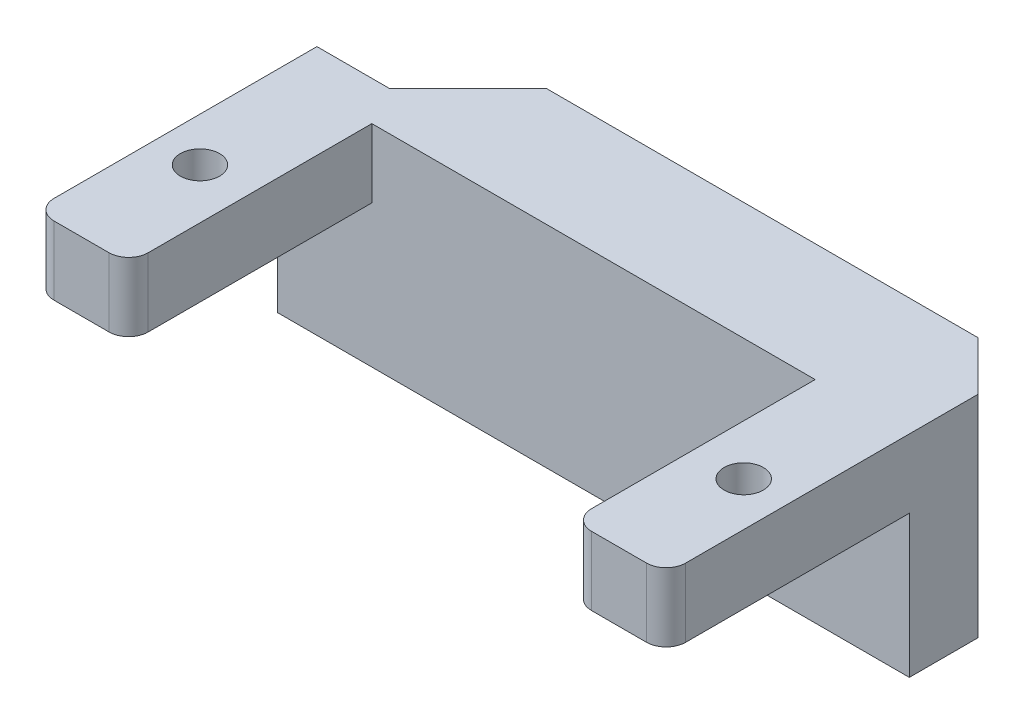
ISO-10303-21;
HEADER;
FILE_DESCRIPTION(('STEP AP214'),'2;1');
FILE_NAME('part.step','',(''),(''),'','','');
FILE_SCHEMA(('AUTOMOTIVE_DESIGN { 1 0 10303 214 1 1 1 1 }'));
ENDSEC;
DATA;
#1=APPLICATION_CONTEXT('core data for automotive mechanical design processes');
#2=APPLICATION_PROTOCOL_DEFINITION('international standard','automotive_design',2000,#1);
#3=PRODUCT_CONTEXT('',#1,'mechanical');
#4=PRODUCT('Part','Part','',(#3));
#5=PRODUCT_RELATED_PRODUCT_CATEGORY('part','',(#4));
#6=PRODUCT_DEFINITION_FORMATION('','',#4);
#7=PRODUCT_DEFINITION_CONTEXT('part definition',#1,'design');
#8=PRODUCT_DEFINITION('design','',#6,#7);
#9=PRODUCT_DEFINITION_SHAPE('','',#8);
#10=(LENGTH_UNIT() NAMED_UNIT(*) SI_UNIT(.MILLI.,.METRE.));
#11=(NAMED_UNIT(*) PLANE_ANGLE_UNIT() SI_UNIT($,.RADIAN.));
#12=(NAMED_UNIT(*) SI_UNIT($,.STERADIAN.) SOLID_ANGLE_UNIT());
#13=UNCERTAINTY_MEASURE_WITH_UNIT(LENGTH_MEASURE(1.E-05),#10,'distance_accuracy_value','');
#14=(GEOMETRIC_REPRESENTATION_CONTEXT(3) GLOBAL_UNCERTAINTY_ASSIGNED_CONTEXT((#13)) GLOBAL_UNIT_ASSIGNED_CONTEXT((#10,
#11,#12)) REPRESENTATION_CONTEXT('',''));
#15=CARTESIAN_POINT('',(0.,0.,0.));
#16=DIRECTION('',(0.,0.,1.));
#17=DIRECTION('',(1.,0.,0.));
#18=AXIS2_PLACEMENT_3D('',#15,#16,#17);
#19=CARTESIAN_POINT('',(12.6,3.5,-5.));
#20=DIRECTION('',(0.,1.,0.));
#21=DIRECTION('',(0.,0.,1.));
#22=AXIS2_PLACEMENT_3D('',#19,#20,#21);
#23=PLANE('',#22);
#24=DIRECTION('',(-1.,0.,0.));
#25=VECTOR('',#24,1.);
#26=CARTESIAN_POINT('',(12.6,3.5,-4.));
#27=LINE('',#26,#25);
#28=CARTESIAN_POINT('',(13.6,3.5,-4.));
#29=VERTEX_POINT('',#28);
#30=CARTESIAN_POINT('',(-8.4,3.5,-4.));
#31=VERTEX_POINT('',#30);
#32=EDGE_CURVE('E414',#29,#31,#27,.T.);
#33=ORIENTED_EDGE('',*,*,#32,.F.);
#34=DIRECTION('',(-0.70710678118655,0.,-0.707106781186545));
#35=VECTOR('',#34,1.);
#36=CARTESIAN_POINT('',(12.6,3.5,-5.));
#37=LINE('',#36,#35);
#38=CARTESIAN_POINT('',(16.1,3.5,-1.50000000000003));
#39=VERTEX_POINT('',#38);
#40=EDGE_CURVE('E190',#29,#39,#37,.F.);
#41=ORIENTED_EDGE('',*,*,#40,.T.);
#42=DIRECTION('',(0.,0.,1.));
#43=VECTOR('',#42,1.);
#44=CARTESIAN_POINT('',(16.1,3.5,14.4));
#45=LINE('',#44,#43);
#46=CARTESIAN_POINT('',(16.1,3.5,2.));
#47=VERTEX_POINT('',#46);
#48=EDGE_CURVE('E251',#39,#47,#45,.T.);
#49=ORIENTED_EDGE('',*,*,#48,.T.);
#50=DIRECTION('',(1.,0.,0.));
#51=VECTOR('',#50,1.);
#52=CARTESIAN_POINT('',(0.,3.5,2.));
#53=LINE('',#52,#51);
#54=CARTESIAN_POINT('',(-16.1,3.5,2.));
#55=VERTEX_POINT('',#54);
#56=EDGE_CURVE('E260',#55,#47,#53,.T.);
#57=ORIENTED_EDGE('',*,*,#56,.F.);
#58=DIRECTION('',(0.,0.,-1.));
#59=VECTOR('',#58,1.);
#60=CARTESIAN_POINT('',(-16.1,3.5,14.4));
#61=LINE('',#60,#59);
#62=CARTESIAN_POINT('',(-16.1,3.5,0.));
#63=VERTEX_POINT('',#62);
#64=EDGE_CURVE('E257',#55,#63,#61,.T.);
#65=ORIENTED_EDGE('',*,*,#64,.T.);
#66=DIRECTION('',(1.,0.,0.));
#67=VECTOR('',#66,1.);
#68=CARTESIAN_POINT('',(0.,3.5,0.));
#69=LINE('',#68,#67);
#70=CARTESIAN_POINT('',(-12.4,3.5,0.));
#71=VERTEX_POINT('',#70);
#72=EDGE_CURVE('E252',#63,#71,#69,.T.);
#73=ORIENTED_EDGE('',*,*,#72,.T.);
#74=DIRECTION('',(-0.707106781186546,0.,0.707106781186549));
#75=VECTOR('',#74,1.);
#76=CARTESIAN_POINT('',(2.59999999999997,3.5,-15.));
#77=LINE('',#76,#75);
#78=EDGE_CURVE('E382',#71,#31,#77,.F.);
#79=ORIENTED_EDGE('',*,*,#78,.T.);
#80=EDGE_LOOP('',(#33,#41,#49,#57,#65,#73,#79));
#81=FACE_BOUND('',#80,.T.);
#82=ADVANCED_FACE('F38',(#81),#23,.F.);
#83=CARTESIAN_POINT('',(-7.4,5.5,-5.));
#84=DIRECTION('',(-0.707106781186549,0.,-0.707106781186546));
#85=DIRECTION('',(0.,-1.,0.));
#86=AXIS2_PLACEMENT_3D('',#83,#84,#85);
#87=PLANE('',#86);
#88=DIRECTION('',(0.,-1.,0.));
#89=VECTOR('',#88,1.);
#90=CARTESIAN_POINT('',(-8.4,5.5,-4.));
#91=LINE('',#90,#89);
#92=CARTESIAN_POINT('',(-8.39999999999999,14.25,-4.));
#93=VERTEX_POINT('',#92);
#94=EDGE_CURVE('E62',#31,#93,#91,.F.);
#95=ORIENTED_EDGE('',*,*,#94,.F.);
#96=ORIENTED_EDGE('',*,*,#78,.F.);
#97=DIRECTION('',(0.,-1.,0.));
#98=VECTOR('',#97,1.);
#99=CARTESIAN_POINT('',(-12.4,3.5,0.));
#100=LINE('',#99,#98);
#101=CARTESIAN_POINT('',(-12.4,14.25,0.));
#102=VERTEX_POINT('',#101);
#103=EDGE_CURVE('E379',#102,#71,#100,.T.);
#104=ORIENTED_EDGE('',*,*,#103,.F.);
#105=DIRECTION('',(-0.707106781186546,0.,0.707106781186549));
#106=VECTOR('',#105,1.);
#107=CARTESIAN_POINT('',(-7.4,14.25,-5.));
#108=LINE('',#107,#106);
#109=EDGE_CURVE('E199',#93,#102,#108,.T.);
#110=ORIENTED_EDGE('',*,*,#109,.F.);
#111=EDGE_LOOP('',(#95,#96,#104,#110));
#112=FACE_BOUND('',#111,.T.);
#113=ADVANCED_FACE('F413',(#112),#87,.T.);
#114=CARTESIAN_POINT('',(12.6,5.5,-5.));
#115=DIRECTION('',(0.707106781186545,0.,-0.70710678118655));
#116=DIRECTION('',(0.,1.,0.));
#117=AXIS2_PLACEMENT_3D('',#114,#115,#116);
#118=PLANE('',#117);
#119=DIRECTION('',(0.,1.,0.));
#120=VECTOR('',#119,1.);
#121=CARTESIAN_POINT('',(13.6,5.5,-4.));
#122=LINE('',#121,#120);
#123=CARTESIAN_POINT('',(13.6,14.25,-4.));
#124=VERTEX_POINT('',#123);
#125=EDGE_CURVE('E180',#124,#29,#122,.F.);
#126=ORIENTED_EDGE('',*,*,#125,.F.);
#127=DIRECTION('',(-0.70710678118655,0.,-0.707106781186545));
#128=VECTOR('',#127,1.);
#129=CARTESIAN_POINT('',(16.1,14.25,-1.50000000000003));
#130=LINE('',#129,#128);
#131=CARTESIAN_POINT('',(16.1,14.25,-1.50000000000003));
#132=VERTEX_POINT('',#131);
#133=EDGE_CURVE('E189',#132,#124,#130,.T.);
#134=ORIENTED_EDGE('',*,*,#133,.F.);
#135=DIRECTION('',(0.,-1.,0.));
#136=VECTOR('',#135,1.);
#137=CARTESIAN_POINT('',(16.1,12.75,-1.50000000000003));
#138=LINE('',#137,#136);
#139=EDGE_CURVE('E47',#39,#132,#138,.F.);
#140=ORIENTED_EDGE('',*,*,#139,.F.);
#141=ORIENTED_EDGE('',*,*,#40,.F.);
#142=EDGE_LOOP('',(#126,#134,#140,#141));
#143=FACE_BOUND('',#142,.T.);
#144=ADVANCED_FACE('F40',(#143),#118,.T.);
#145=CARTESIAN_POINT('',(15.1,14.25,13.4));
#146=DIRECTION('',(0.,1.,0.));
#147=DIRECTION('',(0.,0.,1.));
#148=AXIS2_PLACEMENT_3D('',#145,#146,#147);
#149=PLANE('',#148);
#150=CARTESIAN_POINT('',(13.86,14.25,8.20304748714212));
#151=DIRECTION('',(0.,1.,0.));
#152=DIRECTION('',(0.,0.,1.));
#153=AXIS2_PLACEMENT_3D('',#150,#151,#152);
#154=CIRCLE('',#153,1.);
#155=CARTESIAN_POINT('',(13.86,14.25,9.20304748714212));
#156=VERTEX_POINT('',#155);
#157=EDGE_CURVE('E435',#156,#156,#154,.T.);
#158=ORIENTED_EDGE('',*,*,#157,.F.);
#159=EDGE_LOOP('',(#158));
#160=FACE_BOUND('',#159,.T.);
#161=CARTESIAN_POINT('',(-13.86,14.25,8.20304748714212));
#162=DIRECTION('',(0.,1.,0.));
#163=DIRECTION('',(0.,0.,1.));
#164=AXIS2_PLACEMENT_3D('',#161,#162,#163);
#165=CIRCLE('',#164,1.);
#166=CARTESIAN_POINT('',(-13.86,14.25,9.20304748714212));
#167=VERTEX_POINT('',#166);
#168=EDGE_CURVE('E431',#167,#167,#165,.T.);
#169=ORIENTED_EDGE('',*,*,#168,.F.);
#170=EDGE_LOOP('',(#169));
#171=FACE_BOUND('',#170,.T.);
#172=ORIENTED_EDGE('',*,*,#133,.T.);
#173=DIRECTION('',(-1.,0.,0.));
#174=VECTOR('',#173,1.);
#175=CARTESIAN_POINT('',(15.1,14.25,-4.));
#176=LINE('',#175,#174);
#177=EDGE_CURVE('E11',#124,#93,#176,.T.);
#178=ORIENTED_EDGE('',*,*,#177,.T.);
#179=ORIENTED_EDGE('',*,*,#109,.T.);
#180=DIRECTION('',(-1.,0.,0.));
#181=VECTOR('',#180,1.);
#182=CARTESIAN_POINT('',(-12.4,14.25,0.));
#183=LINE('',#182,#181);
#184=CARTESIAN_POINT('',(-16.1,14.25,0.));
#185=VERTEX_POINT('',#184);
#186=EDGE_CURVE('E203',#102,#185,#183,.T.);
#187=ORIENTED_EDGE('',*,*,#186,.T.);
#188=DIRECTION('',(0.,0.,1.));
#189=VECTOR('',#188,1.);
#190=CARTESIAN_POINT('',(-16.1,14.25,0.));
#191=LINE('',#190,#189);
#192=CARTESIAN_POINT('',(-16.1,14.25,13.4));
#193=VERTEX_POINT('',#192);
#194=EDGE_CURVE('E212',#185,#193,#191,.T.);
#195=ORIENTED_EDGE('',*,*,#194,.T.);
#196=CARTESIAN_POINT('',(-15.1,14.25,13.4));
#197=DIRECTION('',(0.,1.,0.));
#198=DIRECTION('',(0.,0.,1.));
#199=AXIS2_PLACEMENT_3D('',#196,#197,#198);
#200=CIRCLE('',#199,1.);
#201=CARTESIAN_POINT('',(-15.1,14.25,14.4));
#202=VERTEX_POINT('',#201);
#203=EDGE_CURVE('E216',#193,#202,#200,.T.);
#204=ORIENTED_EDGE('',*,*,#203,.T.);
#205=DIRECTION('',(1.,0.,0.));
#206=VECTOR('',#205,1.);
#207=CARTESIAN_POINT('',(-15.1,14.25,14.4));
#208=LINE('',#207,#206);
#209=CARTESIAN_POINT('',(-12.3,14.25,14.4));
#210=VERTEX_POINT('',#209);
#211=EDGE_CURVE('E220',#202,#210,#208,.T.);
#212=ORIENTED_EDGE('',*,*,#211,.T.);
#213=CARTESIAN_POINT('',(-12.3,14.25,13.4));
#214=DIRECTION('',(0.,1.,0.));
#215=DIRECTION('',(0.,0.,1.));
#216=AXIS2_PLACEMENT_3D('',#213,#214,#215);
#217=CIRCLE('',#216,1.);
#218=CARTESIAN_POINT('',(-11.3,14.25,13.4));
#219=VERTEX_POINT('',#218);
#220=EDGE_CURVE('E224',#210,#219,#217,.T.);
#221=ORIENTED_EDGE('',*,*,#220,.T.);
#222=DIRECTION('',(0.,0.,-1.));
#223=VECTOR('',#222,1.);
#224=CARTESIAN_POINT('',(-11.3,14.25,13.4));
#225=LINE('',#224,#223);
#226=CARTESIAN_POINT('',(-11.3,14.25,2.));
#227=VERTEX_POINT('',#226);
#228=EDGE_CURVE('E228',#219,#227,#225,.T.);
#229=ORIENTED_EDGE('',*,*,#228,.T.);
#230=DIRECTION('',(1.,0.,0.));
#231=VECTOR('',#230,1.);
#232=CARTESIAN_POINT('',(-11.3,14.25,2.));
#233=LINE('',#232,#231);
#234=CARTESIAN_POINT('',(11.3,14.25,2.));
#235=VERTEX_POINT('',#234);
#236=EDGE_CURVE('E232',#227,#235,#233,.T.);
#237=ORIENTED_EDGE('',*,*,#236,.T.);
#238=DIRECTION('',(0.,0.,1.));
#239=VECTOR('',#238,1.);
#240=CARTESIAN_POINT('',(11.3,14.25,2.));
#241=LINE('',#240,#239);
#242=CARTESIAN_POINT('',(11.3,14.25,13.4));
#243=VERTEX_POINT('',#242);
#244=EDGE_CURVE('E236',#235,#243,#241,.T.);
#245=ORIENTED_EDGE('',*,*,#244,.T.);
#246=CARTESIAN_POINT('',(12.3,14.25,13.4));
#247=DIRECTION('',(0.,1.,0.));
#248=DIRECTION('',(0.,0.,1.));
#249=AXIS2_PLACEMENT_3D('',#246,#247,#248);
#250=CIRCLE('',#249,1.);
#251=CARTESIAN_POINT('',(12.3,14.25,14.4));
#252=VERTEX_POINT('',#251);
#253=EDGE_CURVE('E240',#243,#252,#250,.T.);
#254=ORIENTED_EDGE('',*,*,#253,.T.);
#255=DIRECTION('',(1.,0.,0.));
#256=VECTOR('',#255,1.);
#257=CARTESIAN_POINT('',(12.3,14.25,14.4));
#258=LINE('',#257,#256);
#259=CARTESIAN_POINT('',(15.1,14.25,14.4));
#260=VERTEX_POINT('',#259);
#261=EDGE_CURVE('E244',#252,#260,#258,.T.);
#262=ORIENTED_EDGE('',*,*,#261,.T.);
#263=CARTESIAN_POINT('',(15.1,14.25,13.4));
#264=DIRECTION('',(0.,1.,0.));
#265=DIRECTION('',(0.,0.,1.));
#266=AXIS2_PLACEMENT_3D('',#263,#264,#265);
#267=CIRCLE('',#266,1.);
#268=CARTESIAN_POINT('',(16.1,14.25,13.4));
#269=VERTEX_POINT('',#268);
#270=EDGE_CURVE('E205',#260,#269,#267,.T.);
#271=ORIENTED_EDGE('',*,*,#270,.T.);
#272=DIRECTION('',(0.,0.,-1.));
#273=VECTOR('',#272,1.);
#274=CARTESIAN_POINT('',(16.1,14.25,13.4));
#275=LINE('',#274,#273);
#276=EDGE_CURVE('E197',#269,#132,#275,.T.);
#277=ORIENTED_EDGE('',*,*,#276,.T.);
#278=EDGE_LOOP('',(#172,#178,#179,#187,#195,#204,#212,#221,#229,#237,#245,#254,#262,#271,#277));
#279=FACE_BOUND('',#278,.T.);
#280=ADVANCED_FACE('F194',(#160,#171,#279),#149,.T.);
#281=CARTESIAN_POINT('',(0.,0.,0.));
#282=DIRECTION('',(0.,0.,1.));
#283=DIRECTION('',(1.,0.,0.));
#284=AXIS2_PLACEMENT_3D('',#281,#282,#283);
#285=PLANE('',#284);
#286=DIRECTION('',(0.,-1.,0.));
#287=VECTOR('',#286,1.);
#288=CARTESIAN_POINT('',(-16.1,12.75,0.));
#289=LINE('',#288,#287);
#290=EDGE_CURVE('E324',#185,#63,#289,.T.);
#291=ORIENTED_EDGE('',*,*,#290,.F.);
#292=ORIENTED_EDGE('',*,*,#186,.F.);
#293=ORIENTED_EDGE('',*,*,#103,.T.);
#294=ORIENTED_EDGE('',*,*,#72,.F.);
#295=EDGE_LOOP('',(#291,#292,#293,#294));
#296=FACE_BOUND('',#295,.T.);
#297=ADVANCED_FACE('F409',(#296),#285,.F.);
#298=CARTESIAN_POINT('',(16.1,12.75,14.4));
#299=DIRECTION('',(-1.,0.,0.));
#300=DIRECTION('',(0.,0.,1.));
#301=AXIS2_PLACEMENT_3D('',#298,#299,#300);
#302=PLANE('',#301);
#303=ORIENTED_EDGE('',*,*,#48,.F.);
#304=ORIENTED_EDGE('',*,*,#139,.T.);
#305=ORIENTED_EDGE('',*,*,#276,.F.);
#306=DIRECTION('',(0.,1.,0.));
#307=VECTOR('',#306,1.);
#308=CARTESIAN_POINT('',(16.1,10.75,13.4));
#309=LINE('',#308,#307);
#310=CARTESIAN_POINT('',(16.1,10.75,13.4));
#311=VERTEX_POINT('',#310);
#312=EDGE_CURVE('E364',#269,#311,#309,.F.);
#313=ORIENTED_EDGE('',*,*,#312,.T.);
#314=DIRECTION('',(0.,0.,1.));
#315=VECTOR('',#314,1.);
#316=CARTESIAN_POINT('',(16.1,10.75,2.));
#317=LINE('',#316,#315);
#318=CARTESIAN_POINT('',(16.1,10.75,2.));
#319=VERTEX_POINT('',#318);
#320=EDGE_CURVE('E317',#319,#311,#317,.T.);
#321=ORIENTED_EDGE('',*,*,#320,.F.);
#322=DIRECTION('',(0.,1.,0.));
#323=VECTOR('',#322,1.);
#324=CARTESIAN_POINT('',(16.1,10.75,2.));
#325=LINE('',#324,#323);
#326=EDGE_CURVE('E308',#47,#319,#325,.T.);
#327=ORIENTED_EDGE('',*,*,#326,.F.);
#328=EDGE_LOOP('',(#303,#304,#305,#313,#321,#327));
#329=FACE_BOUND('',#328,.T.);
#330=ADVANCED_FACE('F390',(#329),#302,.F.);
#331=CARTESIAN_POINT('',(-16.1,12.75,14.4));
#332=DIRECTION('',(1.,0.,0.));
#333=DIRECTION('',(0.,1.,0.));
#334=AXIS2_PLACEMENT_3D('',#331,#332,#333);
#335=PLANE('',#334);
#336=ORIENTED_EDGE('',*,*,#64,.F.);
#337=DIRECTION('',(0.,-1.,0.));
#338=VECTOR('',#337,1.);
#339=CARTESIAN_POINT('',(-16.1,10.75,2.));
#340=LINE('',#339,#338);
#341=CARTESIAN_POINT('',(-16.1,10.75,2.));
#342=VERTEX_POINT('',#341);
#343=EDGE_CURVE('E304',#342,#55,#340,.T.);
#344=ORIENTED_EDGE('',*,*,#343,.F.);
#345=DIRECTION('',(0.,0.,1.));
#346=VECTOR('',#345,1.);
#347=CARTESIAN_POINT('',(-16.1,10.75,2.));
#348=LINE('',#347,#346);
#349=CARTESIAN_POINT('',(-16.1,10.75,13.4));
#350=VERTEX_POINT('',#349);
#351=EDGE_CURVE('E320',#342,#350,#348,.T.);
#352=ORIENTED_EDGE('',*,*,#351,.T.);
#353=DIRECTION('',(0.,-1.,0.));
#354=VECTOR('',#353,1.);
#355=CARTESIAN_POINT('',(-16.1,12.75,13.4));
#356=LINE('',#355,#354);
#357=EDGE_CURVE('E348',#350,#193,#356,.F.);
#358=ORIENTED_EDGE('',*,*,#357,.T.);
#359=ORIENTED_EDGE('',*,*,#194,.F.);
#360=ORIENTED_EDGE('',*,*,#290,.T.);
#361=EDGE_LOOP('',(#336,#344,#352,#358,#359,#360));
#362=FACE_BOUND('',#361,.T.);
#363=ADVANCED_FACE('F403',(#362),#335,.F.);
#364=CARTESIAN_POINT('',(0.,0.,2.));
#365=DIRECTION('',(0.,0.,1.));
#366=DIRECTION('',(1.,0.,0.));
#367=AXIS2_PLACEMENT_3D('',#364,#365,#366);
#368=PLANE('',#367);
#369=DIRECTION('',(0.,1.,0.));
#370=VECTOR('',#369,1.);
#371=CARTESIAN_POINT('',(-11.3,-15.9040157404383,2.));
#372=LINE('',#371,#370);
#373=CARTESIAN_POINT('',(-11.3,10.75,2.));
#374=VERTEX_POINT('',#373);
#375=EDGE_CURVE('E248',#374,#227,#372,.T.);
#376=ORIENTED_EDGE('',*,*,#375,.F.);
#377=DIRECTION('',(-1.,0.,0.));
#378=VECTOR('',#377,1.);
#379=CARTESIAN_POINT('',(-16.1,10.75,2.));
#380=LINE('',#379,#378);
#381=EDGE_CURVE('E312',#374,#342,#380,.T.);
#382=ORIENTED_EDGE('',*,*,#381,.T.);
#383=ORIENTED_EDGE('',*,*,#343,.T.);
#384=ORIENTED_EDGE('',*,*,#56,.T.);
#385=ORIENTED_EDGE('',*,*,#326,.T.);
#386=CARTESIAN_POINT('',(11.3,10.75,2.));
#387=VERTEX_POINT('',#386);
#388=EDGE_CURVE('E313',#319,#387,#380,.T.);
#389=ORIENTED_EDGE('',*,*,#388,.T.);
#390=DIRECTION('',(0.,1.,0.));
#391=VECTOR('',#390,1.);
#392=CARTESIAN_POINT('',(11.3,12.75,2.));
#393=LINE('',#392,#391);
#394=EDGE_CURVE('E370',#387,#235,#393,.T.);
#395=ORIENTED_EDGE('',*,*,#394,.T.);
#396=ORIENTED_EDGE('',*,*,#236,.F.);
#397=EDGE_LOOP('',(#376,#382,#383,#384,#385,#389,#395,#396));
#398=FACE_BOUND('',#397,.T.);
#399=ADVANCED_FACE('F397',(#398),#368,.T.);
#400=CARTESIAN_POINT('',(0.,0.,14.4));
#401=DIRECTION('',(0.,0.,1.));
#402=DIRECTION('',(1.,0.,0.));
#403=AXIS2_PLACEMENT_3D('',#400,#401,#402);
#404=PLANE('',#403);
#405=DIRECTION('',(-1.,0.,0.));
#406=VECTOR('',#405,1.);
#407=CARTESIAN_POINT('',(-16.1,10.75,14.4));
#408=LINE('',#407,#406);
#409=CARTESIAN_POINT('',(15.1,10.75,14.4));
#410=VERTEX_POINT('',#409);
#411=CARTESIAN_POINT('',(12.3,10.75,14.4));
#412=VERTEX_POINT('',#411);
#413=EDGE_CURVE('E309',#410,#412,#408,.T.);
#414=ORIENTED_EDGE('',*,*,#413,.F.);
#415=DIRECTION('',(0.,1.,0.));
#416=VECTOR('',#415,1.);
#417=CARTESIAN_POINT('',(15.1,12.75,14.4));
#418=LINE('',#417,#416);
#419=EDGE_CURVE('E361',#410,#260,#418,.T.);
#420=ORIENTED_EDGE('',*,*,#419,.T.);
#421=ORIENTED_EDGE('',*,*,#261,.F.);
#422=DIRECTION('',(0.,-1.,0.));
#423=VECTOR('',#422,1.);
#424=CARTESIAN_POINT('',(12.3,0.,14.4));
#425=LINE('',#424,#423);
#426=EDGE_CURVE('E351',#252,#412,#425,.T.);
#427=ORIENTED_EDGE('',*,*,#426,.T.);
#428=EDGE_LOOP('',(#414,#420,#421,#427));
#429=FACE_BOUND('',#428,.T.);
#430=ADVANCED_FACE('F460',(#429),#404,.T.);
#431=CARTESIAN_POINT('',(-16.1,10.75,2.));
#432=DIRECTION('',(0.,1.,0.));
#433=DIRECTION('',(0.,0.,1.));
#434=AXIS2_PLACEMENT_3D('',#431,#432,#433);
#435=PLANE('',#434);
#436=CARTESIAN_POINT('',(13.86,10.75,8.20304748714212));
#437=DIRECTION('',(0.,1.,0.));
#438=DIRECTION('',(0.,0.,1.));
#439=AXIS2_PLACEMENT_3D('',#436,#437,#438);
#440=CIRCLE('',#439,1.);
#441=CARTESIAN_POINT('',(13.86,10.75,9.20304748714212));
#442=VERTEX_POINT('',#441);
#443=EDGE_CURVE('E293',#442,#442,#440,.F.);
#444=ORIENTED_EDGE('',*,*,#443,.F.);
#445=EDGE_LOOP('',(#444));
#446=FACE_BOUND('',#445,.T.);
#447=ORIENTED_EDGE('',*,*,#320,.T.);
#448=CARTESIAN_POINT('',(15.1,10.75,13.4));
#449=DIRECTION('',(0.,1.,0.));
#450=DIRECTION('',(0.,0.,1.));
#451=AXIS2_PLACEMENT_3D('',#448,#449,#450);
#452=CIRCLE('',#451,1.);
#453=EDGE_CURVE('E367',#311,#410,#452,.F.);
#454=ORIENTED_EDGE('',*,*,#453,.T.);
#455=ORIENTED_EDGE('',*,*,#413,.T.);
#456=CARTESIAN_POINT('',(12.3,10.75,13.4));
#457=DIRECTION('',(0.,1.,0.));
#458=DIRECTION('',(0.,0.,1.));
#459=AXIS2_PLACEMENT_3D('',#456,#457,#458);
#460=CIRCLE('',#459,1.);
#461=CARTESIAN_POINT('',(11.3,10.75,13.4));
#462=VERTEX_POINT('',#461);
#463=EDGE_CURVE('E355',#412,#462,#460,.F.);
#464=ORIENTED_EDGE('',*,*,#463,.T.);
#465=DIRECTION('',(0.,0.,1.));
#466=VECTOR('',#465,1.);
#467=CARTESIAN_POINT('',(11.3,10.75,0.));
#468=LINE('',#467,#466);
#469=EDGE_CURVE('E299',#387,#462,#468,.T.);
#470=ORIENTED_EDGE('',*,*,#469,.F.);
#471=ORIENTED_EDGE('',*,*,#388,.F.);
#472=EDGE_LOOP('',(#447,#454,#455,#464,#470,#471));
#473=FACE_BOUND('',#472,.T.);
#474=ADVANCED_FACE('F446',(#446,#473),#435,.F.);
#475=DIRECTION('',(0.,-1.,0.));
#476=VECTOR('',#475,1.);
#477=CARTESIAN_POINT('',(-12.3,12.75,14.4));
#478=LINE('',#477,#476);
#479=CARTESIAN_POINT('',(-12.3,10.75,14.4));
#480=VERTEX_POINT('',#479);
#481=EDGE_CURVE('E338',#480,#210,#478,.F.);
#482=ORIENTED_EDGE('',*,*,#481,.T.);
#483=ORIENTED_EDGE('',*,*,#211,.F.);
#484=DIRECTION('',(0.,-1.,0.));
#485=VECTOR('',#484,1.);
#486=CARTESIAN_POINT('',(-15.1,10.75,14.4));
#487=LINE('',#486,#485);
#488=CARTESIAN_POINT('',(-15.1,10.75,14.4));
#489=VERTEX_POINT('',#488);
#490=EDGE_CURVE('E341',#202,#489,#487,.T.);
#491=ORIENTED_EDGE('',*,*,#490,.T.);
#492=EDGE_CURVE('E298',#480,#489,#408,.T.);
#493=ORIENTED_EDGE('',*,*,#492,.F.);
#494=EDGE_LOOP('',(#482,#483,#491,#493));
#495=FACE_BOUND('',#494,.T.);
#496=ADVANCED_FACE('F463',(#495),#404,.T.);
#497=CARTESIAN_POINT('',(-13.86,10.75,8.20304748714212));
#498=DIRECTION('',(0.,1.,0.));
#499=DIRECTION('',(0.,0.,1.));
#500=AXIS2_PLACEMENT_3D('',#497,#498,#499);
#501=CIRCLE('',#500,1.);
#502=CARTESIAN_POINT('',(-13.86,10.75,9.20304748714212));
#503=VERTEX_POINT('',#502);
#504=EDGE_CURVE('E303',#503,#503,#501,.T.);
#505=ORIENTED_EDGE('',*,*,#504,.T.);
#506=EDGE_LOOP('',(#505));
#507=FACE_BOUND('',#506,.T.);
#508=ORIENTED_EDGE('',*,*,#492,.T.);
#509=CARTESIAN_POINT('',(-15.1,10.75,13.4));
#510=DIRECTION('',(0.,1.,0.));
#511=DIRECTION('',(0.,0.,1.));
#512=AXIS2_PLACEMENT_3D('',#509,#510,#511);
#513=CIRCLE('',#512,1.);
#514=EDGE_CURVE('E345',#489,#350,#513,.F.);
#515=ORIENTED_EDGE('',*,*,#514,.T.);
#516=ORIENTED_EDGE('',*,*,#351,.F.);
#517=ORIENTED_EDGE('',*,*,#381,.F.);
#518=DIRECTION('',(0.,0.,1.));
#519=VECTOR('',#518,1.);
#520=CARTESIAN_POINT('',(-11.3,10.75,0.));
#521=LINE('',#520,#519);
#522=CARTESIAN_POINT('',(-11.3,10.75,13.4));
#523=VERTEX_POINT('',#522);
#524=EDGE_CURVE('E294',#374,#523,#521,.T.);
#525=ORIENTED_EDGE('',*,*,#524,.T.);
#526=CARTESIAN_POINT('',(-12.3,10.75,13.4));
#527=DIRECTION('',(0.,1.,0.));
#528=DIRECTION('',(0.,0.,1.));
#529=AXIS2_PLACEMENT_3D('',#526,#527,#528);
#530=CIRCLE('',#529,1.);
#531=EDGE_CURVE('E335',#523,#480,#530,.F.);
#532=ORIENTED_EDGE('',*,*,#531,.T.);
#533=EDGE_LOOP('',(#508,#515,#516,#517,#525,#532));
#534=FACE_BOUND('',#533,.T.);
#535=ADVANCED_FACE('F470',(#507,#534),#435,.F.);
#536=CARTESIAN_POINT('',(-11.3,12.75,0.));
#537=DIRECTION('',(-1.,0.,0.));
#538=DIRECTION('',(0.,0.,1.));
#539=AXIS2_PLACEMENT_3D('',#536,#537,#538);
#540=PLANE('',#539);
#541=ORIENTED_EDGE('',*,*,#524,.F.);
#542=ORIENTED_EDGE('',*,*,#375,.T.);
#543=ORIENTED_EDGE('',*,*,#228,.F.);
#544=DIRECTION('',(0.,-1.,0.));
#545=VECTOR('',#544,1.);
#546=CARTESIAN_POINT('',(-11.3,10.75,13.4));
#547=LINE('',#546,#545);
#548=EDGE_CURVE('E331',#219,#523,#547,.T.);
#549=ORIENTED_EDGE('',*,*,#548,.T.);
#550=EDGE_LOOP('',(#541,#542,#543,#549));
#551=FACE_BOUND('',#550,.T.);
#552=ADVANCED_FACE('F494',(#551),#540,.F.);
#553=CARTESIAN_POINT('',(11.3,12.75,0.));
#554=DIRECTION('',(-1.,0.,0.));
#555=DIRECTION('',(0.,0.,1.));
#556=AXIS2_PLACEMENT_3D('',#553,#554,#555);
#557=PLANE('',#556);
#558=ORIENTED_EDGE('',*,*,#394,.F.);
#559=ORIENTED_EDGE('',*,*,#469,.T.);
#560=DIRECTION('',(0.,-1.,0.));
#561=VECTOR('',#560,1.);
#562=CARTESIAN_POINT('',(11.3,12.75,13.4));
#563=LINE('',#562,#561);
#564=EDGE_CURVE('E358',#462,#243,#563,.F.);
#565=ORIENTED_EDGE('',*,*,#564,.T.);
#566=ORIENTED_EDGE('',*,*,#244,.F.);
#567=EDGE_LOOP('',(#558,#559,#565,#566));
#568=FACE_BOUND('',#567,.T.);
#569=ADVANCED_FACE('F454',(#568),#557,.T.);
#570=CARTESIAN_POINT('',(-12.3,12.75,13.4));
#571=DIRECTION('',(0.,1.,0.));
#572=DIRECTION('',(0.,0.,1.));
#573=AXIS2_PLACEMENT_3D('',#570,#571,#572);
#574=CYLINDRICAL_SURFACE('',#573,1.);
#575=ORIENTED_EDGE('',*,*,#548,.F.);
#576=ORIENTED_EDGE('',*,*,#220,.F.);
#577=ORIENTED_EDGE('',*,*,#481,.F.);
#578=ORIENTED_EDGE('',*,*,#531,.F.);
#579=EDGE_LOOP('',(#575,#576,#577,#578));
#580=FACE_BOUND('',#579,.T.);
#581=ADVANCED_FACE('F499',(#580),#574,.T.);
#582=CARTESIAN_POINT('',(-15.1,0.,13.4));
#583=DIRECTION('',(0.,1.,0.));
#584=DIRECTION('',(-1.,0.,0.));
#585=AXIS2_PLACEMENT_3D('',#582,#583,#584);
#586=CYLINDRICAL_SURFACE('',#585,1.);
#587=ORIENTED_EDGE('',*,*,#490,.F.);
#588=ORIENTED_EDGE('',*,*,#203,.F.);
#589=ORIENTED_EDGE('',*,*,#357,.F.);
#590=ORIENTED_EDGE('',*,*,#514,.F.);
#591=EDGE_LOOP('',(#587,#588,#589,#590));
#592=FACE_BOUND('',#591,.T.);
#593=ADVANCED_FACE('F516',(#592),#586,.T.);
#594=CARTESIAN_POINT('',(12.3,0.,13.4));
#595=DIRECTION('',(0.,-1.,0.));
#596=DIRECTION('',(0.,0.,-1.));
#597=AXIS2_PLACEMENT_3D('',#594,#595,#596);
#598=CYLINDRICAL_SURFACE('',#597,1.);
#599=ORIENTED_EDGE('',*,*,#426,.F.);
#600=ORIENTED_EDGE('',*,*,#253,.F.);
#601=ORIENTED_EDGE('',*,*,#564,.F.);
#602=ORIENTED_EDGE('',*,*,#463,.F.);
#603=EDGE_LOOP('',(#599,#600,#601,#602));
#604=FACE_BOUND('',#603,.T.);
#605=ADVANCED_FACE('F458',(#604),#598,.T.);
#606=CARTESIAN_POINT('',(15.1,0.,13.4));
#607=DIRECTION('',(0.,-1.,0.));
#608=DIRECTION('',(0.,0.,-1.));
#609=AXIS2_PLACEMENT_3D('',#606,#607,#608);
#610=CYLINDRICAL_SURFACE('',#609,1.);
#611=ORIENTED_EDGE('',*,*,#453,.F.);
#612=ORIENTED_EDGE('',*,*,#312,.F.);
#613=ORIENTED_EDGE('',*,*,#270,.F.);
#614=ORIENTED_EDGE('',*,*,#419,.F.);
#615=EDGE_LOOP('',(#611,#612,#613,#614));
#616=FACE_BOUND('',#615,.T.);
#617=ADVANCED_FACE('F444',(#616),#610,.T.);
#618=CARTESIAN_POINT('',(-13.86,2.75,8.20304748714212));
#619=DIRECTION('',(0.,1.,0.));
#620=DIRECTION('',(0.,0.,1.));
#621=AXIS2_PLACEMENT_3D('',#618,#619,#620);
#622=CYLINDRICAL_SURFACE('',#621,1.);
#623=ORIENTED_EDGE('',*,*,#504,.F.);
#624=EDGE_LOOP('',(#623));
#625=FACE_BOUND('',#624,.T.);
#626=ORIENTED_EDGE('',*,*,#168,.T.);
#627=EDGE_LOOP('',(#626));
#628=FACE_BOUND('',#627,.T.);
#629=ADVANCED_FACE('F489',(#625,#628),#622,.F.);
#630=CARTESIAN_POINT('',(13.86,2.75,8.20304748714212));
#631=DIRECTION('',(0.,1.,0.));
#632=DIRECTION('',(0.,0.,1.));
#633=AXIS2_PLACEMENT_3D('',#630,#631,#632);
#634=CYLINDRICAL_SURFACE('',#633,1.);
#635=ORIENTED_EDGE('',*,*,#443,.T.);
#636=EDGE_LOOP('',(#635));
#637=FACE_BOUND('',#636,.T.);
#638=ORIENTED_EDGE('',*,*,#157,.T.);
#639=EDGE_LOOP('',(#638));
#640=FACE_BOUND('',#639,.T.);
#641=ADVANCED_FACE('F486',(#637,#640),#634,.F.);
#642=CARTESIAN_POINT('',(0.,0.,-4.));
#643=DIRECTION('',(0.,0.,-1.));
#644=DIRECTION('',(-1.,0.,0.));
#645=AXIS2_PLACEMENT_3D('',#642,#643,#644);
#646=PLANE('',#645);
#647=ORIENTED_EDGE('',*,*,#32,.T.);
#648=ORIENTED_EDGE('',*,*,#94,.T.);
#649=ORIENTED_EDGE('',*,*,#177,.F.);
#650=ORIENTED_EDGE('',*,*,#125,.T.);
#651=EDGE_LOOP('',(#647,#648,#649,#650));
#652=FACE_BOUND('',#651,.T.);
#653=DIRECTION('',(1.,0.,0.));
#654=VECTOR('',#653,1.);
#655=CARTESIAN_POINT('',(12.6,5.5,-4.));
#656=LINE('',#655,#654);
#657=CARTESIAN_POINT('',(-6.4,5.5,-4.));
#658=VERTEX_POINT('',#657);
#659=CARTESIAN_POINT('',(11.6,5.5,-4.));
#660=VERTEX_POINT('',#659);
#661=EDGE_CURVE('E428',#658,#660,#656,.T.);
#662=ORIENTED_EDGE('',*,*,#661,.T.);
#663=DIRECTION('',(0.,1.,0.));
#664=VECTOR('',#663,1.);
#665=CARTESIAN_POINT('',(11.6,7.,-4.));
#666=LINE('',#665,#664);
#667=CARTESIAN_POINT('',(11.6,7.,-4.));
#668=VERTEX_POINT('',#667);
#669=EDGE_CURVE('E425',#660,#668,#666,.T.);
#670=ORIENTED_EDGE('',*,*,#669,.T.);
#671=DIRECTION('',(-1.,0.,0.));
#672=VECTOR('',#671,1.);
#673=CARTESIAN_POINT('',(11.6,7.,-4.));
#674=LINE('',#673,#672);
#675=CARTESIAN_POINT('',(-6.4,7.,-4.));
#676=VERTEX_POINT('',#675);
#677=EDGE_CURVE('E54',#668,#676,#674,.T.);
#678=ORIENTED_EDGE('',*,*,#677,.T.);
#679=DIRECTION('',(0.,-1.,0.));
#680=VECTOR('',#679,1.);
#681=CARTESIAN_POINT('',(-6.4,7.,-4.));
#682=LINE('',#681,#680);
#683=EDGE_CURVE('E416',#676,#658,#682,.T.);
#684=ORIENTED_EDGE('',*,*,#683,.T.);
#685=EDGE_LOOP('',(#662,#670,#678,#684));
#686=FACE_BOUND('',#685,.T.);
#687=ADVANCED_FACE('F179',(#652,#686),#646,.T.);
#688=DIRECTION('',(0.,1.,0.));
#689=VECTOR('',#688,1.);
#690=CARTESIAN_POINT('',(11.6,7.,0.));
#691=LINE('',#690,#689);
#692=CARTESIAN_POINT('',(11.6,5.5,0.));
#693=VERTEX_POINT('',#692);
#694=CARTESIAN_POINT('',(11.6,7.,0.));
#695=VERTEX_POINT('',#694);
#696=EDGE_CURVE('E256',#693,#695,#691,.T.);
#697=ORIENTED_EDGE('',*,*,#696,.F.);
#698=DIRECTION('',(1.,0.,0.));
#699=VECTOR('',#698,1.);
#700=CARTESIAN_POINT('',(12.6,5.5,0.));
#701=LINE('',#700,#699);
#702=CARTESIAN_POINT('',(-6.4,5.5,0.));
#703=VERTEX_POINT('',#702);
#704=EDGE_CURVE('E289',#703,#693,#701,.T.);
#705=ORIENTED_EDGE('',*,*,#704,.F.);
#706=DIRECTION('',(0.,-1.,0.));
#707=VECTOR('',#706,1.);
#708=CARTESIAN_POINT('',(-6.4,7.,0.));
#709=LINE('',#708,#707);
#710=CARTESIAN_POINT('',(-6.4,7.,0.));
#711=VERTEX_POINT('',#710);
#712=EDGE_CURVE('E273',#711,#703,#709,.T.);
#713=ORIENTED_EDGE('',*,*,#712,.F.);
#714=DIRECTION('',(-1.,0.,0.));
#715=VECTOR('',#714,1.);
#716=CARTESIAN_POINT('',(11.6,7.,0.));
#717=LINE('',#716,#715);
#718=EDGE_CURVE('E269',#695,#711,#717,.T.);
#719=ORIENTED_EDGE('',*,*,#718,.F.);
#720=EDGE_LOOP('',(#697,#705,#713,#719));
#721=FACE_BOUND('',#720,.T.);
#722=ADVANCED_FACE('F569',(#721),#285,.F.);
#723=CARTESIAN_POINT('',(-6.4,7.,-5.));
#724=DIRECTION('',(-1.,0.,0.));
#725=DIRECTION('',(0.,0.,1.));
#726=AXIS2_PLACEMENT_3D('',#723,#724,#725);
#727=PLANE('',#726);
#728=ORIENTED_EDGE('',*,*,#683,.F.);
#729=DIRECTION('',(0.,0.,1.));
#730=VECTOR('',#729,1.);
#731=CARTESIAN_POINT('',(-6.4,7.,-5.));
#732=LINE('',#731,#730);
#733=EDGE_CURVE('E280',#676,#711,#732,.T.);
#734=ORIENTED_EDGE('',*,*,#733,.T.);
#735=ORIENTED_EDGE('',*,*,#712,.T.);
#736=DIRECTION('',(0.,0.,1.));
#737=VECTOR('',#736,1.);
#738=CARTESIAN_POINT('',(-6.4,5.5,-5.));
#739=LINE('',#738,#737);
#740=EDGE_CURVE('E277',#658,#703,#739,.T.);
#741=ORIENTED_EDGE('',*,*,#740,.F.);
#742=EDGE_LOOP('',(#728,#734,#735,#741));
#743=FACE_BOUND('',#742,.T.);
#744=ADVANCED_FACE('F563',(#743),#727,.F.);
#745=CARTESIAN_POINT('',(11.6,7.,-5.));
#746=DIRECTION('',(0.,1.,0.));
#747=DIRECTION('',(0.,0.,1.));
#748=AXIS2_PLACEMENT_3D('',#745,#746,#747);
#749=PLANE('',#748);
#750=ORIENTED_EDGE('',*,*,#677,.F.);
#751=DIRECTION('',(0.,0.,1.));
#752=VECTOR('',#751,1.);
#753=CARTESIAN_POINT('',(11.6,7.,-5.));
#754=LINE('',#753,#752);
#755=EDGE_CURVE('E283',#668,#695,#754,.T.);
#756=ORIENTED_EDGE('',*,*,#755,.T.);
#757=ORIENTED_EDGE('',*,*,#718,.T.);
#758=ORIENTED_EDGE('',*,*,#733,.F.);
#759=EDGE_LOOP('',(#750,#756,#757,#758));
#760=FACE_BOUND('',#759,.T.);
#761=ADVANCED_FACE('F568',(#760),#749,.F.);
#762=CARTESIAN_POINT('',(11.6,7.,-5.));
#763=DIRECTION('',(1.,0.,0.));
#764=DIRECTION('',(0.,0.,-1.));
#765=AXIS2_PLACEMENT_3D('',#762,#763,#764);
#766=PLANE('',#765);
#767=ORIENTED_EDGE('',*,*,#669,.F.);
#768=DIRECTION('',(0.,0.,1.));
#769=VECTOR('',#768,1.);
#770=CARTESIAN_POINT('',(11.6,5.5,-5.));
#771=LINE('',#770,#769);
#772=EDGE_CURVE('E286',#660,#693,#771,.T.);
#773=ORIENTED_EDGE('',*,*,#772,.T.);
#774=ORIENTED_EDGE('',*,*,#696,.T.);
#775=ORIENTED_EDGE('',*,*,#755,.F.);
#776=EDGE_LOOP('',(#767,#773,#774,#775));
#777=FACE_BOUND('',#776,.T.);
#778=ADVANCED_FACE('F578',(#777),#766,.F.);
#779=CARTESIAN_POINT('',(12.6,5.5,-5.));
#780=DIRECTION('',(0.,-1.,0.));
#781=DIRECTION('',(0.,0.,-1.));
#782=AXIS2_PLACEMENT_3D('',#779,#780,#781);
#783=PLANE('',#782);
#784=ORIENTED_EDGE('',*,*,#661,.F.);
#785=ORIENTED_EDGE('',*,*,#740,.T.);
#786=ORIENTED_EDGE('',*,*,#704,.T.);
#787=ORIENTED_EDGE('',*,*,#772,.F.);
#788=EDGE_LOOP('',(#784,#785,#786,#787));
#789=FACE_BOUND('',#788,.T.);
#790=ADVANCED_FACE('F484',(#789),#783,.F.);
#791=CLOSED_SHELL('',(#82,#113,#144,#280,#297,#330,#363,#399,#430,#474,#496,#535,#552,#569,#581,
#593,#605,#617,#629,#641,#687,#722,#744,#761,#778,#790));
#792=MANIFOLD_SOLID_BREP('B2',#791);
#793=ADVANCED_BREP_SHAPE_REPRESENTATION('',(#18,#792),#14);
#794=SHAPE_DEFINITION_REPRESENTATION(#9,#793);
ENDSEC;
END-ISO-10303-21;
